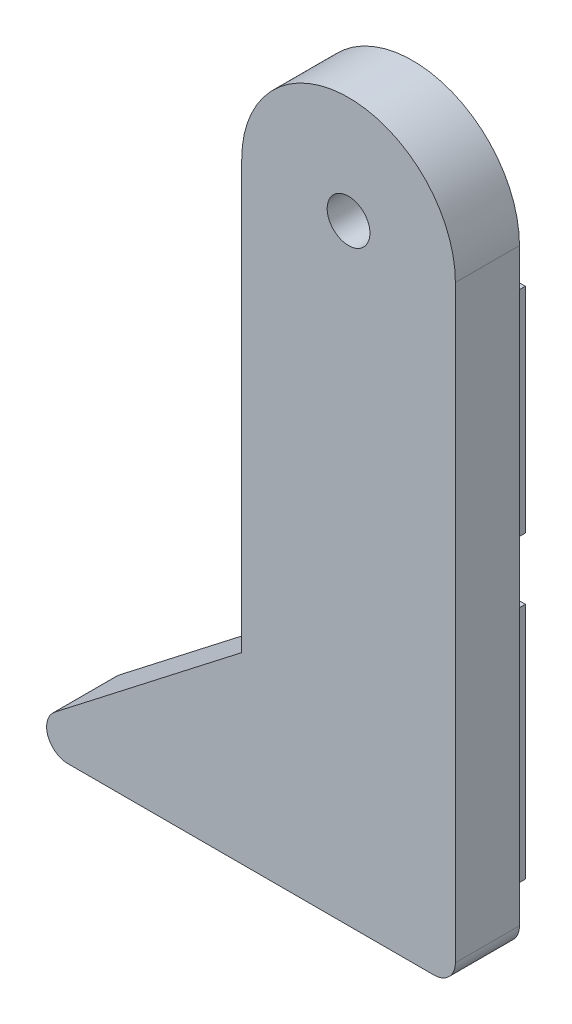
ISO-10303-21;
HEADER;
FILE_DESCRIPTION(('STEP AP214'),'2;1');
FILE_NAME('part.step','',(''),(''),'','','');
FILE_SCHEMA(('AUTOMOTIVE_DESIGN { 1 0 10303 214 1 1 1 1 }'));
ENDSEC;
DATA;
#1=APPLICATION_CONTEXT('core data for automotive mechanical design processes');
#2=APPLICATION_PROTOCOL_DEFINITION('international standard','automotive_design',2000,#1);
#3=PRODUCT_CONTEXT('',#1,'mechanical');
#4=PRODUCT('Part','Part','',(#3));
#5=PRODUCT_RELATED_PRODUCT_CATEGORY('part','',(#4));
#6=PRODUCT_DEFINITION_FORMATION('','',#4);
#7=PRODUCT_DEFINITION_CONTEXT('part definition',#1,'design');
#8=PRODUCT_DEFINITION('design','',#6,#7);
#9=PRODUCT_DEFINITION_SHAPE('','',#8);
#10=(LENGTH_UNIT() NAMED_UNIT(*) SI_UNIT(.MILLI.,.METRE.));
#11=(NAMED_UNIT(*) PLANE_ANGLE_UNIT() SI_UNIT($,.RADIAN.));
#12=(NAMED_UNIT(*) SI_UNIT($,.STERADIAN.) SOLID_ANGLE_UNIT());
#13=UNCERTAINTY_MEASURE_WITH_UNIT(LENGTH_MEASURE(1.E-05),#10,'distance_accuracy_value','');
#14=(GEOMETRIC_REPRESENTATION_CONTEXT(3) GLOBAL_UNCERTAINTY_ASSIGNED_CONTEXT((#13)) GLOBAL_UNIT_ASSIGNED_CONTEXT((#10,
#11,#12)) REPRESENTATION_CONTEXT('',''));
#15=CARTESIAN_POINT('',(0.,0.,0.));
#16=DIRECTION('',(0.,0.,1.));
#17=DIRECTION('',(1.,0.,0.));
#18=AXIS2_PLACEMENT_3D('',#15,#16,#17);
#19=CARTESIAN_POINT('',(0.,0.,0.));
#20=DIRECTION('',(0.,0.,1.));
#21=DIRECTION('',(1.,0.,0.));
#22=AXIS2_PLACEMENT_3D('',#19,#20,#21);
#23=PLANE('',#22);
#24=DIRECTION('',(1.,0.,0.));
#25=VECTOR('',#24,1.);
#26=CARTESIAN_POINT('',(2.99595345271442,-2.51040248948641,0.));
#27=LINE('',#26,#25);
#28=CARTESIAN_POINT('',(2.99595345271442,-2.51040248948641,0.));
#29=VERTEX_POINT('',#28);
#30=CARTESIAN_POINT('',(4.27531212116673,-2.51040248948641,0.));
#31=VERTEX_POINT('',#30);
#32=EDGE_CURVE('E232',#29,#31,#27,.T.);
#33=ORIENTED_EDGE('',*,*,#32,.F.);
#34=DIRECTION('',(0.,1.,0.));
#35=VECTOR('',#34,1.);
#36=CARTESIAN_POINT('',(2.99595345271442,-4.95569520370185,0.));
#37=LINE('',#36,#35);
#38=CARTESIAN_POINT('',(2.99595345271442,-4.95569520370185,0.));
#39=VERTEX_POINT('',#38);
#40=EDGE_CURVE('E299',#39,#29,#37,.T.);
#41=ORIENTED_EDGE('',*,*,#40,.F.);
#42=DIRECTION('',(0.864387868708014,-0.502825628255379,0.));
#43=VECTOR('',#42,1.);
#44=CARTESIAN_POINT('',(-1.20765360077173,-2.51040248948641,0.));
#45=LINE('',#44,#43);
#46=CARTESIAN_POINT('',(-1.20765360077173,-2.51040248948641,0.));
#47=VERTEX_POINT('',#46);
#48=EDGE_CURVE('E346',#47,#39,#45,.T.);
#49=ORIENTED_EDGE('',*,*,#48,.F.);
#50=DIRECTION('',(1.,0.,0.));
#51=VECTOR('',#50,1.);
#52=CARTESIAN_POINT('',(-4.31466750987019,-2.51040248948641,0.));
#53=LINE('',#52,#51);
#54=CARTESIAN_POINT('',(-4.31466750987019,-2.51040248948641,0.));
#55=VERTEX_POINT('',#54);
#56=EDGE_CURVE('E343',#55,#47,#53,.T.);
#57=ORIENTED_EDGE('',*,*,#56,.F.);
#58=DIRECTION('',(-0.864387868708014,0.502825628255379,0.));
#59=VECTOR('',#58,1.);
#60=CARTESIAN_POINT('',(2.99595345271442,-6.76308547073065,0.));
#61=LINE('',#60,#59);
#62=CARTESIAN_POINT('',(2.99595345271442,-6.76308547073066,0.));
#63=VERTEX_POINT('',#62);
#64=EDGE_CURVE('E340',#63,#55,#61,.T.);
#65=ORIENTED_EDGE('',*,*,#64,.F.);
#66=DIRECTION('',(0.785813113906077,0.618464024833486,0.));
#67=VECTOR('',#66,1.);
#68=CARTESIAN_POINT('',(-4.31466750987019,-12.5168149320241,0.));
#69=LINE('',#68,#67);
#70=CARTESIAN_POINT('',(-4.31466750987019,-12.5168149320241,0.));
#71=VERTEX_POINT('',#70);
#72=EDGE_CURVE('E337',#71,#63,#69,.T.);
#73=ORIENTED_EDGE('',*,*,#72,.F.);
#74=DIRECTION('',(-1.,0.,0.));
#75=VECTOR('',#74,1.);
#76=CARTESIAN_POINT('',(-1.93871569703019,-12.5168149320241,0.));
#77=LINE('',#76,#75);
#78=CARTESIAN_POINT('',(-1.93871569703019,-12.5168149320241,0.));
#79=VERTEX_POINT('',#78);
#80=EDGE_CURVE('E334',#79,#71,#77,.T.);
#81=ORIENTED_EDGE('',*,*,#80,.F.);
#82=DIRECTION('',(-0.785813113906077,-0.618464024833486,0.));
#83=VECTOR('',#82,1.);
#84=CARTESIAN_POINT('',(2.99595345271442,-8.63304754565102,0.));
#85=LINE('',#84,#83);
#86=CARTESIAN_POINT('',(2.99595345271442,-8.63304754565102,0.));
#87=VERTEX_POINT('',#86);
#88=EDGE_CURVE('E331',#87,#79,#85,.T.);
#89=ORIENTED_EDGE('',*,*,#88,.F.);
#90=DIRECTION('',(0.,1.,0.));
#91=VECTOR('',#90,1.);
#92=CARTESIAN_POINT('',(2.99595345271442,-12.5168149320241,0.));
#93=LINE('',#92,#91);
#94=CARTESIAN_POINT('',(2.99595345271442,-12.5168149320241,0.));
#95=VERTEX_POINT('',#94);
#96=EDGE_CURVE('E328',#95,#87,#93,.T.);
#97=ORIENTED_EDGE('',*,*,#96,.F.);
#98=DIRECTION('',(-1.,0.,0.));
#99=VECTOR('',#98,1.);
#100=CARTESIAN_POINT('',(4.27531212116673,-12.5168149320241,0.));
#101=LINE('',#100,#99);
#102=CARTESIAN_POINT('',(4.27531212116673,-12.5168149320241,0.));
#103=VERTEX_POINT('',#102);
#104=EDGE_CURVE('E325',#103,#95,#101,.T.);
#105=ORIENTED_EDGE('',*,*,#104,.F.);
#106=DIRECTION('',(0.,-1.,0.));
#107=VECTOR('',#106,1.);
#108=CARTESIAN_POINT('',(4.27531212116673,-2.51040248948641,0.));
#109=LINE('',#108,#107);
#110=EDGE_CURVE('E322',#31,#103,#109,.T.);
#111=ORIENTED_EDGE('',*,*,#110,.F.);
#112=EDGE_LOOP('',(#33,#41,#49,#57,#65,#73,#81,#89,#97,#105,#111));
#113=FACE_BOUND('',#112,.T.);
#114=DIRECTION('',(0.,1.,0.));
#115=VECTOR('',#114,1.);
#116=CARTESIAN_POINT('',(5.,-20.,0.));
#117=LINE('',#116,#115);
#118=CARTESIAN_POINT('',(5.,-27.5715056715313,0.));
#119=VERTEX_POINT('',#118);
#120=CARTESIAN_POINT('',(5.,0.,0.));
#121=VERTEX_POINT('',#120);
#122=EDGE_CURVE('E404',#119,#121,#117,.T.);
#123=ORIENTED_EDGE('',*,*,#122,.F.);
#124=CARTESIAN_POINT('',(4.,-27.5715056715313,0.));
#125=DIRECTION('',(0.,0.,1.));
#126=DIRECTION('',(1.,0.,0.));
#127=AXIS2_PLACEMENT_3D('',#124,#125,#126);
#128=CIRCLE('',#127,1.);
#129=CARTESIAN_POINT('',(4.,-28.5715056715313,0.));
#130=VERTEX_POINT('',#129);
#131=EDGE_CURVE('E11',#119,#130,#128,.F.);
#132=ORIENTED_EDGE('',*,*,#131,.T.);
#133=DIRECTION('',(-1.,0.,0.));
#134=VECTOR('',#133,1.);
#135=CARTESIAN_POINT('',(0.,-28.5715056715313,0.));
#136=LINE('',#135,#134);
#137=CARTESIAN_POINT('',(-13.1319402109181,-28.5715056715313,0.));
#138=VERTEX_POINT('',#137);
#139=EDGE_CURVE('E386',#130,#138,#136,.T.);
#140=ORIENTED_EDGE('',*,*,#139,.T.);
#141=CARTESIAN_POINT('',(-13.1319402109181,-27.5715056715313,0.));
#142=DIRECTION('',(0.,0.,1.));
#143=DIRECTION('',(1.,0.,0.));
#144=AXIS2_PLACEMENT_3D('',#141,#142,#143);
#145=CIRCLE('',#144,1.);
#146=CARTESIAN_POINT('',(-13.7447429846144,-26.78126978235,0.));
#147=VERTEX_POINT('',#146);
#148=EDGE_CURVE('E431',#138,#147,#145,.F.);
#149=ORIENTED_EDGE('',*,*,#148,.T.);
#150=DIRECTION('',(0.790235889181246,0.612802773696338,0.));
#151=VECTOR('',#150,1.);
#152=CARTESIAN_POINT('',(7.80753869804357,-10.0681614871782,0.));
#153=LINE('',#152,#151);
#154=CARTESIAN_POINT('',(-5.,-20.,0.));
#155=VERTEX_POINT('',#154);
#156=EDGE_CURVE('E384',#147,#155,#153,.T.);
#157=ORIENTED_EDGE('',*,*,#156,.T.);
#158=DIRECTION('',(0.,-1.,0.));
#159=VECTOR('',#158,1.);
#160=CARTESIAN_POINT('',(-5.,0.,0.));
#161=LINE('',#160,#159);
#162=CARTESIAN_POINT('',(-5.,0.,0.));
#163=VERTEX_POINT('',#162);
#164=EDGE_CURVE('E411',#163,#155,#161,.T.);
#165=ORIENTED_EDGE('',*,*,#164,.F.);
#166=CARTESIAN_POINT('',(0.,0.,0.));
#167=DIRECTION('',(0.,0.,1.));
#168=DIRECTION('',(1.,0.,0.));
#169=AXIS2_PLACEMENT_3D('',#166,#167,#168);
#170=CIRCLE('',#169,5.);
#171=EDGE_CURVE('E397',#121,#163,#170,.T.);
#172=ORIENTED_EDGE('',*,*,#171,.F.);
#173=EDGE_LOOP('',(#123,#132,#140,#149,#157,#165,#172));
#174=FACE_BOUND('',#173,.T.);
#175=CARTESIAN_POINT('',(0.,0.,0.));
#176=DIRECTION('',(0.,0.,1.));
#177=DIRECTION('',(1.,0.,0.));
#178=AXIS2_PLACEMENT_3D('',#175,#176,#177);
#179=CIRCLE('',#178,1.);
#180=CARTESIAN_POINT('',(1.,0.,0.));
#181=VERTEX_POINT('',#180);
#182=EDGE_CURVE('E393',#181,#181,#179,.T.);
#183=ORIENTED_EDGE('',*,*,#182,.T.);
#184=EDGE_LOOP('',(#183));
#185=FACE_BOUND('',#184,.T.);
#186=DIRECTION('',(1.,0.,0.));
#187=VECTOR('',#186,1.);
#188=CARTESIAN_POINT('',(2.99595345271442,-15.4018992761871,0.));
#189=LINE('',#188,#187);
#190=CARTESIAN_POINT('',(2.99595345271442,-15.4018992761871,0.));
#191=VERTEX_POINT('',#190);
#192=CARTESIAN_POINT('',(4.27531212116673,-15.4018992761871,0.));
#193=VERTEX_POINT('',#192);
#194=EDGE_CURVE('E225',#191,#193,#189,.T.);
#195=ORIENTED_EDGE('',*,*,#194,.F.);
#196=DIRECTION('',(0.,1.,0.));
#197=VECTOR('',#196,1.);
#198=CARTESIAN_POINT('',(2.99595345271442,-18.4613300843939,0.));
#199=LINE('',#198,#197);
#200=CARTESIAN_POINT('',(2.99595345271442,-18.4613300843939,0.));
#201=VERTEX_POINT('',#200);
#202=EDGE_CURVE('E227',#201,#191,#199,.T.);
#203=ORIENTED_EDGE('',*,*,#202,.F.);
#204=DIRECTION('',(0.80852907484341,-0.588456230430828,0.));
#205=VECTOR('',#204,1.);
#206=CARTESIAN_POINT('',(-1.20765360077173,-15.4018992761871,0.));
#207=LINE('',#206,#205);
#208=CARTESIAN_POINT('',(-1.20765360077173,-15.4018992761871,0.));
#209=VERTEX_POINT('',#208);
#210=EDGE_CURVE('E243',#209,#201,#207,.T.);
#211=ORIENTED_EDGE('',*,*,#210,.F.);
#212=DIRECTION('',(1.,0.,0.));
#213=VECTOR('',#212,1.);
#214=CARTESIAN_POINT('',(-4.31466750987019,-15.4018992761871,0.));
#215=LINE('',#214,#213);
#216=CARTESIAN_POINT('',(-4.31466750987019,-15.4018992761871,0.));
#217=VERTEX_POINT('',#216);
#218=EDGE_CURVE('E257',#217,#209,#215,.T.);
#219=ORIENTED_EDGE('',*,*,#218,.F.);
#220=DIRECTION('',(-0.80852907484341,0.588456230430827,0.));
#221=VECTOR('',#220,1.);
#222=CARTESIAN_POINT('',(2.99595345271442,-20.7226485078511,0.));
#223=LINE('',#222,#221);
#224=CARTESIAN_POINT('',(2.99595345271442,-20.7226485078511,0.));
#225=VERTEX_POINT('',#224);
#226=EDGE_CURVE('E260',#225,#217,#223,.T.);
#227=ORIENTED_EDGE('',*,*,#226,.F.);
#228=DIRECTION('',(0.782280144548001,0.622926781769703,0.));
#229=VECTOR('',#228,1.);
#230=CARTESIAN_POINT('',(-4.31466750987019,-26.5440689039833,0.));
#231=LINE('',#230,#229);
#232=CARTESIAN_POINT('',(-4.31466750987019,-26.5440689039833,0.));
#233=VERTEX_POINT('',#232);
#234=EDGE_CURVE('E263',#233,#225,#231,.T.);
#235=ORIENTED_EDGE('',*,*,#234,.F.);
#236=DIRECTION('',(-1.,0.,0.));
#237=VECTOR('',#236,1.);
#238=CARTESIAN_POINT('',(-1.93871569703019,-26.5440689039833,0.));
#239=LINE('',#238,#237);
#240=CARTESIAN_POINT('',(-1.93871569703019,-26.5440689039833,0.));
#241=VERTEX_POINT('',#240);
#242=EDGE_CURVE('E266',#241,#233,#239,.T.);
#243=ORIENTED_EDGE('',*,*,#242,.F.);
#244=DIRECTION('',(-0.782280144548001,-0.622926781769703,0.));
#245=VECTOR('',#244,1.);
#246=CARTESIAN_POINT('',(2.99595345271442,-22.6146101365941,0.));
#247=LINE('',#246,#245);
#248=CARTESIAN_POINT('',(2.99595345271442,-22.6146101365941,0.));
#249=VERTEX_POINT('',#248);
#250=EDGE_CURVE('E269',#249,#241,#247,.T.);
#251=ORIENTED_EDGE('',*,*,#250,.F.);
#252=DIRECTION('',(0.,1.,0.));
#253=VECTOR('',#252,1.);
#254=CARTESIAN_POINT('',(2.99595345271442,-26.5440689039833,0.));
#255=LINE('',#254,#253);
#256=CARTESIAN_POINT('',(2.99595345271442,-26.5440689039833,0.));
#257=VERTEX_POINT('',#256);
#258=EDGE_CURVE('E272',#257,#249,#255,.T.);
#259=ORIENTED_EDGE('',*,*,#258,.F.);
#260=DIRECTION('',(-1.,0.,0.));
#261=VECTOR('',#260,1.);
#262=CARTESIAN_POINT('',(4.27531212116673,-26.5440689039833,0.));
#263=LINE('',#262,#261);
#264=CARTESIAN_POINT('',(4.27531212116673,-26.5440689039833,0.));
#265=VERTEX_POINT('',#264);
#266=EDGE_CURVE('E59',#265,#257,#263,.T.);
#267=ORIENTED_EDGE('',*,*,#266,.F.);
#268=DIRECTION('',(0.,-1.,0.));
#269=VECTOR('',#268,1.);
#270=CARTESIAN_POINT('',(4.27531212116673,-15.4018992761871,0.));
#271=LINE('',#270,#269);
#272=EDGE_CURVE('E54',#193,#265,#271,.T.);
#273=ORIENTED_EDGE('',*,*,#272,.F.);
#274=EDGE_LOOP('',(#195,#203,#211,#219,#227,#235,#243,#251,#259,#267,#273));
#275=FACE_BOUND('',#274,.T.);
#276=ADVANCED_FACE('F39',(#113,#174,#185,#275),#23,.F.);
#277=CARTESIAN_POINT('',(0.,0.,3.));
#278=DIRECTION('',(0.,0.,1.));
#279=DIRECTION('',(1.,0.,0.));
#280=AXIS2_PLACEMENT_3D('',#277,#278,#279);
#281=PLANE('',#280);
#282=DIRECTION('',(1.,0.,0.));
#283=VECTOR('',#282,1.);
#284=CARTESIAN_POINT('',(0.,-28.5715056715313,3.));
#285=LINE('',#284,#283);
#286=CARTESIAN_POINT('',(-13.1319402109181,-28.5715056715313,3.));
#287=VERTEX_POINT('',#286);
#288=CARTESIAN_POINT('',(4.,-28.5715056715313,3.));
#289=VERTEX_POINT('',#288);
#290=EDGE_CURVE('E387',#287,#289,#285,.T.);
#291=ORIENTED_EDGE('',*,*,#290,.T.);
#292=CARTESIAN_POINT('',(4.,-27.5715056715313,3.));
#293=DIRECTION('',(0.,0.,1.));
#294=DIRECTION('',(1.,0.,0.));
#295=AXIS2_PLACEMENT_3D('',#292,#293,#294);
#296=CIRCLE('',#295,1.);
#297=CARTESIAN_POINT('',(5.,-27.5715056715313,3.));
#298=VERTEX_POINT('',#297);
#299=EDGE_CURVE('E436',#289,#298,#296,.T.);
#300=ORIENTED_EDGE('',*,*,#299,.T.);
#301=DIRECTION('',(0.,1.,0.));
#302=VECTOR('',#301,1.);
#303=CARTESIAN_POINT('',(5.,-20.,3.));
#304=LINE('',#303,#302);
#305=CARTESIAN_POINT('',(5.,0.,3.));
#306=VERTEX_POINT('',#305);
#307=EDGE_CURVE('E406',#298,#306,#304,.T.);
#308=ORIENTED_EDGE('',*,*,#307,.T.);
#309=CARTESIAN_POINT('',(0.,0.,3.));
#310=DIRECTION('',(0.,0.,1.));
#311=DIRECTION('',(1.,0.,0.));
#312=AXIS2_PLACEMENT_3D('',#309,#310,#311);
#313=CIRCLE('',#312,5.);
#314=CARTESIAN_POINT('',(-5.,0.,3.));
#315=VERTEX_POINT('',#314);
#316=EDGE_CURVE('E400',#306,#315,#313,.T.);
#317=ORIENTED_EDGE('',*,*,#316,.T.);
#318=DIRECTION('',(0.,-1.,0.));
#319=VECTOR('',#318,1.);
#320=CARTESIAN_POINT('',(-5.,0.,3.));
#321=LINE('',#320,#319);
#322=CARTESIAN_POINT('',(-5.,-20.,3.));
#323=VERTEX_POINT('',#322);
#324=EDGE_CURVE('E403',#315,#323,#321,.T.);
#325=ORIENTED_EDGE('',*,*,#324,.T.);
#326=DIRECTION('',(-0.790235889181246,-0.612802773696338,0.));
#327=VECTOR('',#326,1.);
#328=CARTESIAN_POINT('',(7.80753869804357,-10.0681614871782,3.));
#329=LINE('',#328,#327);
#330=CARTESIAN_POINT('',(-13.7447429846144,-26.78126978235,3.));
#331=VERTEX_POINT('',#330);
#332=EDGE_CURVE('E383',#323,#331,#329,.T.);
#333=ORIENTED_EDGE('',*,*,#332,.T.);
#334=CARTESIAN_POINT('',(-13.1319402109181,-27.5715056715313,3.));
#335=DIRECTION('',(0.,0.,1.));
#336=DIRECTION('',(1.,0.,0.));
#337=AXIS2_PLACEMENT_3D('',#334,#335,#336);
#338=CIRCLE('',#337,1.);
#339=EDGE_CURVE('E426',#331,#287,#338,.T.);
#340=ORIENTED_EDGE('',*,*,#339,.T.);
#341=EDGE_LOOP('',(#291,#300,#308,#317,#325,#333,#340));
#342=FACE_BOUND('',#341,.T.);
#343=CARTESIAN_POINT('',(0.,0.,3.));
#344=DIRECTION('',(0.,0.,1.));
#345=DIRECTION('',(1.,0.,0.));
#346=AXIS2_PLACEMENT_3D('',#343,#344,#345);
#347=CIRCLE('',#346,1.);
#348=CARTESIAN_POINT('',(1.,0.,3.));
#349=VERTEX_POINT('',#348);
#350=EDGE_CURVE('E394',#349,#349,#347,.T.);
#351=ORIENTED_EDGE('',*,*,#350,.F.);
#352=EDGE_LOOP('',(#351));
#353=FACE_BOUND('',#352,.T.);
#354=ADVANCED_FACE('F455',(#342,#353),#281,.T.);
#355=CARTESIAN_POINT('',(0.,0.,3.));
#356=DIRECTION('',(0.,0.,-1.));
#357=DIRECTION('',(-1.,0.,0.));
#358=AXIS2_PLACEMENT_3D('',#355,#356,#357);
#359=CYLINDRICAL_SURFACE('',#358,5.);
#360=ORIENTED_EDGE('',*,*,#171,.T.);
#361=DIRECTION('',(0.,0.,-1.));
#362=VECTOR('',#361,1.);
#363=CARTESIAN_POINT('',(-5.,0.,3.));
#364=LINE('',#363,#362);
#365=EDGE_CURVE('E420',#315,#163,#364,.T.);
#366=ORIENTED_EDGE('',*,*,#365,.F.);
#367=ORIENTED_EDGE('',*,*,#316,.F.);
#368=DIRECTION('',(0.,0.,-1.));
#369=VECTOR('',#368,1.);
#370=CARTESIAN_POINT('',(5.,0.,3.));
#371=LINE('',#370,#369);
#372=EDGE_CURVE('E408',#306,#121,#371,.T.);
#373=ORIENTED_EDGE('',*,*,#372,.T.);
#374=EDGE_LOOP('',(#360,#366,#367,#373));
#375=FACE_BOUND('',#374,.T.);
#376=ADVANCED_FACE('F471',(#375),#359,.T.);
#377=CARTESIAN_POINT('',(-5.,0.,3.));
#378=DIRECTION('',(1.,0.,0.));
#379=DIRECTION('',(0.,1.,0.));
#380=AXIS2_PLACEMENT_3D('',#377,#378,#379);
#381=PLANE('',#380);
#382=ORIENTED_EDGE('',*,*,#164,.T.);
#383=DIRECTION('',(0.,0.,-1.));
#384=VECTOR('',#383,1.);
#385=CARTESIAN_POINT('',(-5.,-20.,3.));
#386=LINE('',#385,#384);
#387=EDGE_CURVE('E417',#323,#155,#386,.T.);
#388=ORIENTED_EDGE('',*,*,#387,.F.);
#389=ORIENTED_EDGE('',*,*,#324,.F.);
#390=ORIENTED_EDGE('',*,*,#365,.T.);
#391=EDGE_LOOP('',(#382,#388,#389,#390));
#392=FACE_BOUND('',#391,.T.);
#393=ADVANCED_FACE('F467',(#392),#381,.F.);
#394=CARTESIAN_POINT('',(5.,-20.,3.));
#395=DIRECTION('',(-1.,0.,0.));
#396=DIRECTION('',(0.,-1.,0.));
#397=AXIS2_PLACEMENT_3D('',#394,#395,#396);
#398=PLANE('',#397);
#399=ORIENTED_EDGE('',*,*,#307,.F.);
#400=DIRECTION('',(0.,0.,1.));
#401=VECTOR('',#400,1.);
#402=CARTESIAN_POINT('',(5.,-27.5715056715313,0.));
#403=LINE('',#402,#401);
#404=EDGE_CURVE('E47',#298,#119,#403,.F.);
#405=ORIENTED_EDGE('',*,*,#404,.T.);
#406=ORIENTED_EDGE('',*,*,#122,.T.);
#407=ORIENTED_EDGE('',*,*,#372,.F.);
#408=EDGE_LOOP('',(#399,#405,#406,#407));
#409=FACE_BOUND('',#408,.T.);
#410=ADVANCED_FACE('F441',(#409),#398,.F.);
#411=CARTESIAN_POINT('',(0.,0.,3.));
#412=DIRECTION('',(0.,0.,-1.));
#413=DIRECTION('',(-1.,0.,0.));
#414=AXIS2_PLACEMENT_3D('',#411,#412,#413);
#415=CYLINDRICAL_SURFACE('',#414,1.);
#416=ORIENTED_EDGE('',*,*,#350,.T.);
#417=EDGE_LOOP('',(#416));
#418=FACE_BOUND('',#417,.T.);
#419=ORIENTED_EDGE('',*,*,#182,.F.);
#420=EDGE_LOOP('',(#419));
#421=FACE_BOUND('',#420,.T.);
#422=ADVANCED_FACE('F488',(#418,#421),#415,.F.);
#423=CARTESIAN_POINT('',(7.80753869804357,-10.0681614871782,-22.73133128622));
#424=DIRECTION('',(-0.612802773696338,0.790235889181246,0.));
#425=DIRECTION('',(-0.790235889181246,-0.612802773696338,0.));
#426=AXIS2_PLACEMENT_3D('',#423,#424,#425);
#427=PLANE('',#426);
#428=ORIENTED_EDGE('',*,*,#156,.F.);
#429=DIRECTION('',(0.,0.,1.));
#430=VECTOR('',#429,1.);
#431=CARTESIAN_POINT('',(-13.7447429846144,-26.78126978235,-22.73133128622));
#432=LINE('',#431,#430);
#433=EDGE_CURVE('E423',#147,#331,#432,.T.);
#434=ORIENTED_EDGE('',*,*,#433,.T.);
#435=ORIENTED_EDGE('',*,*,#332,.F.);
#436=ORIENTED_EDGE('',*,*,#387,.T.);
#437=EDGE_LOOP('',(#428,#434,#435,#436));
#438=FACE_BOUND('',#437,.T.);
#439=ADVANCED_FACE('F464',(#438),#427,.T.);
#440=CARTESIAN_POINT('',(0.,-28.5715056715313,-22.73133128622));
#441=DIRECTION('',(0.,-1.,0.));
#442=DIRECTION('',(0.,0.,-1.));
#443=AXIS2_PLACEMENT_3D('',#440,#441,#442);
#444=PLANE('',#443);
#445=ORIENTED_EDGE('',*,*,#139,.F.);
#446=DIRECTION('',(0.,0.,1.));
#447=VECTOR('',#446,1.);
#448=CARTESIAN_POINT('',(4.,-28.5715056715313,3.));
#449=LINE('',#448,#447);
#450=EDGE_CURVE('E433',#130,#289,#449,.T.);
#451=ORIENTED_EDGE('',*,*,#450,.T.);
#452=ORIENTED_EDGE('',*,*,#290,.F.);
#453=DIRECTION('',(0.,0.,1.));
#454=VECTOR('',#453,1.);
#455=CARTESIAN_POINT('',(-13.1319402109181,-28.5715056715313,-22.73133128622));
#456=LINE('',#455,#454);
#457=EDGE_CURVE('E428',#287,#138,#456,.F.);
#458=ORIENTED_EDGE('',*,*,#457,.T.);
#459=EDGE_LOOP('',(#445,#451,#452,#458));
#460=FACE_BOUND('',#459,.T.);
#461=ADVANCED_FACE('F452',(#460),#444,.T.);
#462=CARTESIAN_POINT('',(-13.1319402109181,-27.5715056715313,-22.73133128622));
#463=DIRECTION('',(0.,0.,1.));
#464=DIRECTION('',(1.,0.,0.));
#465=AXIS2_PLACEMENT_3D('',#462,#463,#464);
#466=CYLINDRICAL_SURFACE('',#465,1.);
#467=ORIENTED_EDGE('',*,*,#148,.F.);
#468=ORIENTED_EDGE('',*,*,#457,.F.);
#469=ORIENTED_EDGE('',*,*,#339,.F.);
#470=ORIENTED_EDGE('',*,*,#433,.F.);
#471=EDGE_LOOP('',(#467,#468,#469,#470));
#472=FACE_BOUND('',#471,.T.);
#473=ADVANCED_FACE('F461',(#472),#466,.T.);
#474=CARTESIAN_POINT('',(4.,-27.5715056715313,-22.73133128622));
#475=DIRECTION('',(0.,0.,-1.));
#476=DIRECTION('',(-1.,0.,0.));
#477=AXIS2_PLACEMENT_3D('',#474,#475,#476);
#478=CYLINDRICAL_SURFACE('',#477,1.);
#479=ORIENTED_EDGE('',*,*,#131,.F.);
#480=ORIENTED_EDGE('',*,*,#404,.F.);
#481=ORIENTED_EDGE('',*,*,#299,.F.);
#482=ORIENTED_EDGE('',*,*,#450,.F.);
#483=EDGE_LOOP('',(#479,#480,#481,#482));
#484=FACE_BOUND('',#483,.T.);
#485=ADVANCED_FACE('F41',(#484),#478,.T.);
#486=CARTESIAN_POINT('',(2.99595345271442,-2.51040248948641,-1.));
#487=DIRECTION('',(0.,-1.,0.));
#488=DIRECTION('',(0.,0.,-1.));
#489=AXIS2_PLACEMENT_3D('',#486,#487,#488);
#490=PLANE('',#489);
#491=ORIENTED_EDGE('',*,*,#32,.T.);
#492=DIRECTION('',(0.,0.,1.));
#493=VECTOR('',#492,1.);
#494=CARTESIAN_POINT('',(4.27531212116673,-2.51040248948641,-1.));
#495=LINE('',#494,#493);
#496=CARTESIAN_POINT('',(4.27531212116673,-2.51040248948641,-1.));
#497=VERTEX_POINT('',#496);
#498=EDGE_CURVE('E380',#497,#31,#495,.T.);
#499=ORIENTED_EDGE('',*,*,#498,.F.);
#500=DIRECTION('',(1.,0.,0.));
#501=VECTOR('',#500,1.);
#502=CARTESIAN_POINT('',(2.99595345271442,-2.51040248948641,-1.));
#503=LINE('',#502,#501);
#504=CARTESIAN_POINT('',(2.99595345271442,-2.51040248948641,-1.));
#505=VERTEX_POINT('',#504);
#506=EDGE_CURVE('E295',#505,#497,#503,.T.);
#507=ORIENTED_EDGE('',*,*,#506,.F.);
#508=DIRECTION('',(0.,0.,1.));
#509=VECTOR('',#508,1.);
#510=CARTESIAN_POINT('',(2.99595345271442,-2.51040248948641,-1.));
#511=LINE('',#510,#509);
#512=EDGE_CURVE('E319',#505,#29,#511,.T.);
#513=ORIENTED_EDGE('',*,*,#512,.T.);
#514=EDGE_LOOP('',(#491,#499,#507,#513));
#515=FACE_BOUND('',#514,.T.);
#516=ADVANCED_FACE('F501',(#515),#490,.F.);
#517=CARTESIAN_POINT('',(4.27531212116673,-2.51040248948641,-1.));
#518=DIRECTION('',(-1.,0.,0.));
#519=DIRECTION('',(0.,0.,1.));
#520=AXIS2_PLACEMENT_3D('',#517,#518,#519);
#521=PLANE('',#520);
#522=ORIENTED_EDGE('',*,*,#110,.T.);
#523=DIRECTION('',(0.,0.,1.));
#524=VECTOR('',#523,1.);
#525=CARTESIAN_POINT('',(4.27531212116673,-12.5168149320241,-1.));
#526=LINE('',#525,#524);
#527=CARTESIAN_POINT('',(4.27531212116673,-12.5168149320241,-1.));
#528=VERTEX_POINT('',#527);
#529=EDGE_CURVE('E377',#528,#103,#526,.T.);
#530=ORIENTED_EDGE('',*,*,#529,.F.);
#531=DIRECTION('',(0.,-1.,0.));
#532=VECTOR('',#531,1.);
#533=CARTESIAN_POINT('',(4.27531212116673,-2.51040248948641,-1.));
#534=LINE('',#533,#532);
#535=EDGE_CURVE('E298',#497,#528,#534,.T.);
#536=ORIENTED_EDGE('',*,*,#535,.F.);
#537=ORIENTED_EDGE('',*,*,#498,.T.);
#538=EDGE_LOOP('',(#522,#530,#536,#537));
#539=FACE_BOUND('',#538,.T.);
#540=ADVANCED_FACE('F504',(#539),#521,.F.);
#541=CARTESIAN_POINT('',(4.27531212116673,-12.5168149320241,-1.));
#542=DIRECTION('',(0.,1.,0.));
#543=DIRECTION('',(0.,0.,1.));
#544=AXIS2_PLACEMENT_3D('',#541,#542,#543);
#545=PLANE('',#544);
#546=ORIENTED_EDGE('',*,*,#104,.T.);
#547=DIRECTION('',(0.,0.,1.));
#548=VECTOR('',#547,1.);
#549=CARTESIAN_POINT('',(2.99595345271442,-12.5168149320241,-1.));
#550=LINE('',#549,#548);
#551=CARTESIAN_POINT('',(2.99595345271442,-12.5168149320241,-1.));
#552=VERTEX_POINT('',#551);
#553=EDGE_CURVE('E374',#552,#95,#550,.T.);
#554=ORIENTED_EDGE('',*,*,#553,.F.);
#555=DIRECTION('',(-1.,0.,0.));
#556=VECTOR('',#555,1.);
#557=CARTESIAN_POINT('',(4.27531212116673,-12.5168149320241,-1.));
#558=LINE('',#557,#556);
#559=EDGE_CURVE('E301',#528,#552,#558,.T.);
#560=ORIENTED_EDGE('',*,*,#559,.F.);
#561=ORIENTED_EDGE('',*,*,#529,.T.);
#562=EDGE_LOOP('',(#546,#554,#560,#561));
#563=FACE_BOUND('',#562,.T.);
#564=ADVANCED_FACE('F508',(#563),#545,.F.);
#565=CARTESIAN_POINT('',(2.99595345271442,-12.5168149320241,-1.));
#566=DIRECTION('',(1.,0.,0.));
#567=DIRECTION('',(0.,0.,-1.));
#568=AXIS2_PLACEMENT_3D('',#565,#566,#567);
#569=PLANE('',#568);
#570=ORIENTED_EDGE('',*,*,#96,.T.);
#571=DIRECTION('',(0.,0.,1.));
#572=VECTOR('',#571,1.);
#573=CARTESIAN_POINT('',(2.99595345271442,-8.63304754565102,-1.));
#574=LINE('',#573,#572);
#575=CARTESIAN_POINT('',(2.99595345271442,-8.63304754565102,-1.));
#576=VERTEX_POINT('',#575);
#577=EDGE_CURVE('E371',#576,#87,#574,.T.);
#578=ORIENTED_EDGE('',*,*,#577,.F.);
#579=DIRECTION('',(0.,1.,0.));
#580=VECTOR('',#579,1.);
#581=CARTESIAN_POINT('',(2.99595345271442,-12.5168149320241,-1.));
#582=LINE('',#581,#580);
#583=EDGE_CURVE('E303',#552,#576,#582,.T.);
#584=ORIENTED_EDGE('',*,*,#583,.F.);
#585=ORIENTED_EDGE('',*,*,#553,.T.);
#586=EDGE_LOOP('',(#570,#578,#584,#585));
#587=FACE_BOUND('',#586,.T.);
#588=ADVANCED_FACE('F512',(#587),#569,.F.);
#589=CARTESIAN_POINT('',(2.99595345271442,-8.63304754565102,-1.));
#590=DIRECTION('',(-0.618464024833486,0.785813113906077,0.));
#591=DIRECTION('',(-0.785813113906077,-0.618464024833486,0.));
#592=AXIS2_PLACEMENT_3D('',#589,#590,#591);
#593=PLANE('',#592);
#594=ORIENTED_EDGE('',*,*,#88,.T.);
#595=DIRECTION('',(0.,0.,1.));
#596=VECTOR('',#595,1.);
#597=CARTESIAN_POINT('',(-1.93871569703019,-12.5168149320241,-1.));
#598=LINE('',#597,#596);
#599=CARTESIAN_POINT('',(-1.93871569703019,-12.5168149320241,-1.));
#600=VERTEX_POINT('',#599);
#601=EDGE_CURVE('E368',#600,#79,#598,.T.);
#602=ORIENTED_EDGE('',*,*,#601,.F.);
#603=DIRECTION('',(-0.785813113906077,-0.618464024833486,0.));
#604=VECTOR('',#603,1.);
#605=CARTESIAN_POINT('',(2.99595345271442,-8.63304754565102,-1.));
#606=LINE('',#605,#604);
#607=EDGE_CURVE('E305',#576,#600,#606,.T.);
#608=ORIENTED_EDGE('',*,*,#607,.F.);
#609=ORIENTED_EDGE('',*,*,#577,.T.);
#610=EDGE_LOOP('',(#594,#602,#608,#609));
#611=FACE_BOUND('',#610,.T.);
#612=ADVANCED_FACE('F516',(#611),#593,.F.);
#613=CARTESIAN_POINT('',(-1.93871569703019,-12.5168149320241,-1.));
#614=DIRECTION('',(0.,1.,0.));
#615=DIRECTION('',(0.,0.,1.));
#616=AXIS2_PLACEMENT_3D('',#613,#614,#615);
#617=PLANE('',#616);
#618=ORIENTED_EDGE('',*,*,#80,.T.);
#619=DIRECTION('',(0.,0.,1.));
#620=VECTOR('',#619,1.);
#621=CARTESIAN_POINT('',(-4.31466750987019,-12.5168149320241,-1.));
#622=LINE('',#621,#620);
#623=CARTESIAN_POINT('',(-4.31466750987019,-12.5168149320241,-1.));
#624=VERTEX_POINT('',#623);
#625=EDGE_CURVE('E365',#624,#71,#622,.T.);
#626=ORIENTED_EDGE('',*,*,#625,.F.);
#627=DIRECTION('',(-1.,0.,0.));
#628=VECTOR('',#627,1.);
#629=CARTESIAN_POINT('',(-1.93871569703019,-12.5168149320241,-1.));
#630=LINE('',#629,#628);
#631=EDGE_CURVE('E307',#600,#624,#630,.T.);
#632=ORIENTED_EDGE('',*,*,#631,.F.);
#633=ORIENTED_EDGE('',*,*,#601,.T.);
#634=EDGE_LOOP('',(#618,#626,#632,#633));
#635=FACE_BOUND('',#634,.T.);
#636=ADVANCED_FACE('F520',(#635),#617,.F.);
#637=CARTESIAN_POINT('',(-4.31466750987019,-12.5168149320241,-1.));
#638=DIRECTION('',(0.618464024833486,-0.785813113906077,0.));
#639=DIRECTION('',(0.785813113906077,0.618464024833486,0.));
#640=AXIS2_PLACEMENT_3D('',#637,#638,#639);
#641=PLANE('',#640);
#642=ORIENTED_EDGE('',*,*,#72,.T.);
#643=DIRECTION('',(0.,0.,1.));
#644=VECTOR('',#643,1.);
#645=CARTESIAN_POINT('',(2.99595345271442,-6.76308547073065,-1.));
#646=LINE('',#645,#644);
#647=CARTESIAN_POINT('',(2.99595345271442,-6.76308547073065,-1.));
#648=VERTEX_POINT('',#647);
#649=EDGE_CURVE('E362',#648,#63,#646,.T.);
#650=ORIENTED_EDGE('',*,*,#649,.F.);
#651=DIRECTION('',(0.785813113906077,0.618464024833486,0.));
#652=VECTOR('',#651,1.);
#653=CARTESIAN_POINT('',(-4.31466750987019,-12.5168149320241,-1.));
#654=LINE('',#653,#652);
#655=EDGE_CURVE('E309',#624,#648,#654,.T.);
#656=ORIENTED_EDGE('',*,*,#655,.F.);
#657=ORIENTED_EDGE('',*,*,#625,.T.);
#658=EDGE_LOOP('',(#642,#650,#656,#657));
#659=FACE_BOUND('',#658,.T.);
#660=ADVANCED_FACE('F524',(#659),#641,.F.);
#661=CARTESIAN_POINT('',(2.99595345271442,-6.76308547073065,-1.));
#662=DIRECTION('',(0.502825628255379,0.864387868708014,0.));
#663=DIRECTION('',(-0.864387868708014,0.502825628255379,0.));
#664=AXIS2_PLACEMENT_3D('',#661,#662,#663);
#665=PLANE('',#664);
#666=ORIENTED_EDGE('',*,*,#64,.T.);
#667=DIRECTION('',(0.,0.,1.));
#668=VECTOR('',#667,1.);
#669=CARTESIAN_POINT('',(-4.31466750987019,-2.51040248948641,-1.));
#670=LINE('',#669,#668);
#671=CARTESIAN_POINT('',(-4.31466750987019,-2.51040248948641,-1.));
#672=VERTEX_POINT('',#671);
#673=EDGE_CURVE('E359',#672,#55,#670,.T.);
#674=ORIENTED_EDGE('',*,*,#673,.F.);
#675=DIRECTION('',(-0.864387868708014,0.502825628255379,0.));
#676=VECTOR('',#675,1.);
#677=CARTESIAN_POINT('',(2.99595345271442,-6.76308547073065,-1.));
#678=LINE('',#677,#676);
#679=EDGE_CURVE('E311',#648,#672,#678,.T.);
#680=ORIENTED_EDGE('',*,*,#679,.F.);
#681=ORIENTED_EDGE('',*,*,#649,.T.);
#682=EDGE_LOOP('',(#666,#674,#680,#681));
#683=FACE_BOUND('',#682,.T.);
#684=ADVANCED_FACE('F528',(#683),#665,.F.);
#685=CARTESIAN_POINT('',(-4.31466750987019,-2.51040248948641,-1.));
#686=DIRECTION('',(0.,-1.,0.));
#687=DIRECTION('',(0.,0.,-1.));
#688=AXIS2_PLACEMENT_3D('',#685,#686,#687);
#689=PLANE('',#688);
#690=ORIENTED_EDGE('',*,*,#56,.T.);
#691=DIRECTION('',(0.,0.,1.));
#692=VECTOR('',#691,1.);
#693=CARTESIAN_POINT('',(-1.20765360077173,-2.51040248948641,-1.));
#694=LINE('',#693,#692);
#695=CARTESIAN_POINT('',(-1.20765360077173,-2.51040248948641,-1.));
#696=VERTEX_POINT('',#695);
#697=EDGE_CURVE('E356',#696,#47,#694,.T.);
#698=ORIENTED_EDGE('',*,*,#697,.F.);
#699=DIRECTION('',(1.,0.,0.));
#700=VECTOR('',#699,1.);
#701=CARTESIAN_POINT('',(-4.31466750987019,-2.51040248948641,-1.));
#702=LINE('',#701,#700);
#703=EDGE_CURVE('E313',#672,#696,#702,.T.);
#704=ORIENTED_EDGE('',*,*,#703,.F.);
#705=ORIENTED_EDGE('',*,*,#673,.T.);
#706=EDGE_LOOP('',(#690,#698,#704,#705));
#707=FACE_BOUND('',#706,.T.);
#708=ADVANCED_FACE('F532',(#707),#689,.F.);
#709=CARTESIAN_POINT('',(-1.20765360077173,-2.51040248948641,-1.));
#710=DIRECTION('',(-0.502825628255379,-0.864387868708014,0.));
#711=DIRECTION('',(0.864387868708014,-0.502825628255379,0.));
#712=AXIS2_PLACEMENT_3D('',#709,#710,#711);
#713=PLANE('',#712);
#714=ORIENTED_EDGE('',*,*,#48,.T.);
#715=DIRECTION('',(0.,0.,1.));
#716=VECTOR('',#715,1.);
#717=CARTESIAN_POINT('',(2.99595345271442,-4.95569520370185,-1.));
#718=LINE('',#717,#716);
#719=CARTESIAN_POINT('',(2.99595345271442,-4.95569520370185,-1.));
#720=VERTEX_POINT('',#719);
#721=EDGE_CURVE('E353',#720,#39,#718,.T.);
#722=ORIENTED_EDGE('',*,*,#721,.F.);
#723=DIRECTION('',(0.864387868708014,-0.502825628255379,0.));
#724=VECTOR('',#723,1.);
#725=CARTESIAN_POINT('',(-1.20765360077173,-2.51040248948641,-1.));
#726=LINE('',#725,#724);
#727=EDGE_CURVE('E315',#696,#720,#726,.T.);
#728=ORIENTED_EDGE('',*,*,#727,.F.);
#729=ORIENTED_EDGE('',*,*,#697,.T.);
#730=EDGE_LOOP('',(#714,#722,#728,#729));
#731=FACE_BOUND('',#730,.T.);
#732=ADVANCED_FACE('F536',(#731),#713,.F.);
#733=CARTESIAN_POINT('',(2.99595345271442,-4.95569520370185,-1.));
#734=DIRECTION('',(1.,0.,0.));
#735=DIRECTION('',(0.,0.,-1.));
#736=AXIS2_PLACEMENT_3D('',#733,#734,#735);
#737=PLANE('',#736);
#738=ORIENTED_EDGE('',*,*,#40,.T.);
#739=ORIENTED_EDGE('',*,*,#512,.F.);
#740=DIRECTION('',(0.,1.,0.));
#741=VECTOR('',#740,1.);
#742=CARTESIAN_POINT('',(2.99595345271442,-4.95569520370185,-1.));
#743=LINE('',#742,#741);
#744=EDGE_CURVE('E317',#720,#505,#743,.T.);
#745=ORIENTED_EDGE('',*,*,#744,.F.);
#746=ORIENTED_EDGE('',*,*,#721,.T.);
#747=EDGE_LOOP('',(#738,#739,#745,#746));
#748=FACE_BOUND('',#747,.T.);
#749=ADVANCED_FACE('F540',(#748),#737,.F.);
#750=CARTESIAN_POINT('',(0.,0.,-1.));
#751=DIRECTION('',(0.,0.,-1.));
#752=DIRECTION('',(-1.,0.,0.));
#753=AXIS2_PLACEMENT_3D('',#750,#751,#752);
#754=PLANE('',#753);
#755=ORIENTED_EDGE('',*,*,#506,.T.);
#756=ORIENTED_EDGE('',*,*,#535,.T.);
#757=ORIENTED_EDGE('',*,*,#559,.T.);
#758=ORIENTED_EDGE('',*,*,#583,.T.);
#759=ORIENTED_EDGE('',*,*,#607,.T.);
#760=ORIENTED_EDGE('',*,*,#631,.T.);
#761=ORIENTED_EDGE('',*,*,#655,.T.);
#762=ORIENTED_EDGE('',*,*,#679,.T.);
#763=ORIENTED_EDGE('',*,*,#703,.T.);
#764=ORIENTED_EDGE('',*,*,#727,.T.);
#765=ORIENTED_EDGE('',*,*,#744,.T.);
#766=EDGE_LOOP('',(#755,#756,#757,#758,#759,#760,#761,#762,#763,#764,#765));
#767=FACE_BOUND('',#766,.T.);
#768=ADVANCED_FACE('F544',(#767),#754,.T.);
#769=CARTESIAN_POINT('',(2.99595345271442,-15.4018992761871,-1.));
#770=DIRECTION('',(0.,-1.,0.));
#771=DIRECTION('',(0.,0.,-1.));
#772=AXIS2_PLACEMENT_3D('',#769,#770,#771);
#773=PLANE('',#772);
#774=ORIENTED_EDGE('',*,*,#194,.T.);
#775=DIRECTION('',(0.,0.,1.));
#776=VECTOR('',#775,1.);
#777=CARTESIAN_POINT('',(4.27531212116673,-15.4018992761871,-1.));
#778=LINE('',#777,#776);
#779=CARTESIAN_POINT('',(4.27531212116673,-15.4018992761871,-1.));
#780=VERTEX_POINT('',#779);
#781=EDGE_CURVE('E871',#780,#193,#778,.T.);
#782=ORIENTED_EDGE('',*,*,#781,.F.);
#783=DIRECTION('',(1.,0.,0.));
#784=VECTOR('',#783,1.);
#785=CARTESIAN_POINT('',(2.99595345271442,-15.4018992761871,-1.));
#786=LINE('',#785,#784);
#787=CARTESIAN_POINT('',(2.99595345271442,-15.4018992761871,-1.));
#788=VERTEX_POINT('',#787);
#789=EDGE_CURVE('E244',#788,#780,#786,.T.);
#790=ORIENTED_EDGE('',*,*,#789,.F.);
#791=DIRECTION('',(0.,0.,1.));
#792=VECTOR('',#791,1.);
#793=CARTESIAN_POINT('',(2.99595345271442,-15.4018992761871,-1.));
#794=LINE('',#793,#792);
#795=EDGE_CURVE('E239',#788,#191,#794,.T.);
#796=ORIENTED_EDGE('',*,*,#795,.T.);
#797=EDGE_LOOP('',(#774,#782,#790,#796));
#798=FACE_BOUND('',#797,.T.);
#799=ADVANCED_FACE('F246',(#798),#773,.F.);
#800=CARTESIAN_POINT('',(4.27531212116673,-15.4018992761871,-1.));
#801=DIRECTION('',(-1.,0.,0.));
#802=DIRECTION('',(0.,0.,1.));
#803=AXIS2_PLACEMENT_3D('',#800,#801,#802);
#804=PLANE('',#803);
#805=ORIENTED_EDGE('',*,*,#272,.T.);
#806=DIRECTION('',(0.,0.,1.));
#807=VECTOR('',#806,1.);
#808=CARTESIAN_POINT('',(4.27531212116673,-26.5440689039833,-1.));
#809=LINE('',#808,#807);
#810=CARTESIAN_POINT('',(4.27531212116673,-26.5440689039833,-1.));
#811=VERTEX_POINT('',#810);
#812=EDGE_CURVE('E869',#811,#265,#809,.T.);
#813=ORIENTED_EDGE('',*,*,#812,.F.);
#814=DIRECTION('',(0.,-1.,0.));
#815=VECTOR('',#814,1.);
#816=CARTESIAN_POINT('',(4.27531212116673,-15.4018992761871,-1.));
#817=LINE('',#816,#815);
#818=EDGE_CURVE('E292',#780,#811,#817,.T.);
#819=ORIENTED_EDGE('',*,*,#818,.F.);
#820=ORIENTED_EDGE('',*,*,#781,.T.);
#821=EDGE_LOOP('',(#805,#813,#819,#820));
#822=FACE_BOUND('',#821,.T.);
#823=ADVANCED_FACE('F586',(#822),#804,.F.);
#824=CARTESIAN_POINT('',(4.27531212116673,-26.5440689039833,-1.));
#825=DIRECTION('',(0.,1.,0.));
#826=DIRECTION('',(0.,0.,1.));
#827=AXIS2_PLACEMENT_3D('',#824,#825,#826);
#828=PLANE('',#827);
#829=ORIENTED_EDGE('',*,*,#266,.T.);
#830=DIRECTION('',(0.,0.,1.));
#831=VECTOR('',#830,1.);
#832=CARTESIAN_POINT('',(2.99595345271442,-26.5440689039833,-1.));
#833=LINE('',#832,#831);
#834=CARTESIAN_POINT('',(2.99595345271442,-26.5440689039833,-1.));
#835=VERTEX_POINT('',#834);
#836=EDGE_CURVE('E874',#835,#257,#833,.T.);
#837=ORIENTED_EDGE('',*,*,#836,.F.);
#838=DIRECTION('',(-1.,0.,0.));
#839=VECTOR('',#838,1.);
#840=CARTESIAN_POINT('',(4.27531212116673,-26.5440689039833,-1.));
#841=LINE('',#840,#839);
#842=EDGE_CURVE('E290',#811,#835,#841,.T.);
#843=ORIENTED_EDGE('',*,*,#842,.F.);
#844=ORIENTED_EDGE('',*,*,#812,.T.);
#845=EDGE_LOOP('',(#829,#837,#843,#844));
#846=FACE_BOUND('',#845,.T.);
#847=ADVANCED_FACE('F582',(#846),#828,.F.);
#848=CARTESIAN_POINT('',(2.99595345271442,-26.5440689039833,-1.));
#849=DIRECTION('',(1.,0.,0.));
#850=DIRECTION('',(0.,0.,-1.));
#851=AXIS2_PLACEMENT_3D('',#848,#849,#850);
#852=PLANE('',#851);
#853=ORIENTED_EDGE('',*,*,#258,.T.);
#854=DIRECTION('',(0.,0.,1.));
#855=VECTOR('',#854,1.);
#856=CARTESIAN_POINT('',(2.99595345271442,-22.6146101365941,-1.));
#857=LINE('',#856,#855);
#858=CARTESIAN_POINT('',(2.99595345271442,-22.6146101365941,-1.));
#859=VERTEX_POINT('',#858);
#860=EDGE_CURVE('E876',#859,#249,#857,.T.);
#861=ORIENTED_EDGE('',*,*,#860,.F.);
#862=DIRECTION('',(0.,1.,0.));
#863=VECTOR('',#862,1.);
#864=CARTESIAN_POINT('',(2.99595345271442,-26.5440689039833,-1.));
#865=LINE('',#864,#863);
#866=EDGE_CURVE('E288',#835,#859,#865,.T.);
#867=ORIENTED_EDGE('',*,*,#866,.F.);
#868=ORIENTED_EDGE('',*,*,#836,.T.);
#869=EDGE_LOOP('',(#853,#861,#867,#868));
#870=FACE_BOUND('',#869,.T.);
#871=ADVANCED_FACE('F578',(#870),#852,.F.);
#872=CARTESIAN_POINT('',(2.99595345271442,-22.6146101365941,-1.));
#873=DIRECTION('',(-0.622926781769703,0.782280144548001,0.));
#874=DIRECTION('',(-0.782280144548001,-0.622926781769703,0.));
#875=AXIS2_PLACEMENT_3D('',#872,#873,#874);
#876=PLANE('',#875);
#877=ORIENTED_EDGE('',*,*,#250,.T.);
#878=DIRECTION('',(0.,0.,1.));
#879=VECTOR('',#878,1.);
#880=CARTESIAN_POINT('',(-1.93871569703019,-26.5440689039833,-1.));
#881=LINE('',#880,#879);
#882=CARTESIAN_POINT('',(-1.93871569703019,-26.5440689039833,-1.));
#883=VERTEX_POINT('',#882);
#884=EDGE_CURVE('E882',#883,#241,#881,.T.);
#885=ORIENTED_EDGE('',*,*,#884,.F.);
#886=DIRECTION('',(-0.782280144548001,-0.622926781769703,0.));
#887=VECTOR('',#886,1.);
#888=CARTESIAN_POINT('',(2.99595345271442,-22.6146101365941,-1.));
#889=LINE('',#888,#887);
#890=EDGE_CURVE('E286',#859,#883,#889,.T.);
#891=ORIENTED_EDGE('',*,*,#890,.F.);
#892=ORIENTED_EDGE('',*,*,#860,.T.);
#893=EDGE_LOOP('',(#877,#885,#891,#892));
#894=FACE_BOUND('',#893,.T.);
#895=ADVANCED_FACE('F574',(#894),#876,.F.);
#896=CARTESIAN_POINT('',(-1.93871569703019,-26.5440689039833,-1.));
#897=DIRECTION('',(0.,1.,0.));
#898=DIRECTION('',(0.,0.,1.));
#899=AXIS2_PLACEMENT_3D('',#896,#897,#898);
#900=PLANE('',#899);
#901=ORIENTED_EDGE('',*,*,#242,.T.);
#902=DIRECTION('',(0.,0.,1.));
#903=VECTOR('',#902,1.);
#904=CARTESIAN_POINT('',(-4.31466750987019,-26.5440689039833,-1.));
#905=LINE('',#904,#903);
#906=CARTESIAN_POINT('',(-4.31466750987019,-26.5440689039833,-1.));
#907=VERTEX_POINT('',#906);
#908=EDGE_CURVE('E885',#907,#233,#905,.T.);
#909=ORIENTED_EDGE('',*,*,#908,.F.);
#910=DIRECTION('',(-1.,0.,0.));
#911=VECTOR('',#910,1.);
#912=CARTESIAN_POINT('',(-1.93871569703019,-26.5440689039833,-1.));
#913=LINE('',#912,#911);
#914=EDGE_CURVE('E284',#883,#907,#913,.T.);
#915=ORIENTED_EDGE('',*,*,#914,.F.);
#916=ORIENTED_EDGE('',*,*,#884,.T.);
#917=EDGE_LOOP('',(#901,#909,#915,#916));
#918=FACE_BOUND('',#917,.T.);
#919=ADVANCED_FACE('F570',(#918),#900,.F.);
#920=CARTESIAN_POINT('',(-4.31466750987019,-26.5440689039833,-1.));
#921=DIRECTION('',(0.622926781769703,-0.782280144548001,0.));
#922=DIRECTION('',(0.782280144548001,0.622926781769703,0.));
#923=AXIS2_PLACEMENT_3D('',#920,#921,#922);
#924=PLANE('',#923);
#925=ORIENTED_EDGE('',*,*,#234,.T.);
#926=DIRECTION('',(0.,0.,1.));
#927=VECTOR('',#926,1.);
#928=CARTESIAN_POINT('',(2.99595345271442,-20.7226485078511,-1.));
#929=LINE('',#928,#927);
#930=CARTESIAN_POINT('',(2.99595345271442,-20.7226485078511,-1.));
#931=VERTEX_POINT('',#930);
#932=EDGE_CURVE('E888',#931,#225,#929,.T.);
#933=ORIENTED_EDGE('',*,*,#932,.F.);
#934=DIRECTION('',(0.782280144548001,0.622926781769703,0.));
#935=VECTOR('',#934,1.);
#936=CARTESIAN_POINT('',(-4.31466750987019,-26.5440689039833,-1.));
#937=LINE('',#936,#935);
#938=EDGE_CURVE('E282',#907,#931,#937,.T.);
#939=ORIENTED_EDGE('',*,*,#938,.F.);
#940=ORIENTED_EDGE('',*,*,#908,.T.);
#941=EDGE_LOOP('',(#925,#933,#939,#940));
#942=FACE_BOUND('',#941,.T.);
#943=ADVANCED_FACE('F566',(#942),#924,.F.);
#944=CARTESIAN_POINT('',(2.99595345271442,-20.7226485078511,-1.));
#945=DIRECTION('',(0.588456230430827,0.80852907484341,0.));
#946=DIRECTION('',(-0.80852907484341,0.588456230430827,0.));
#947=AXIS2_PLACEMENT_3D('',#944,#945,#946);
#948=PLANE('',#947);
#949=ORIENTED_EDGE('',*,*,#226,.T.);
#950=DIRECTION('',(0.,0.,1.));
#951=VECTOR('',#950,1.);
#952=CARTESIAN_POINT('',(-4.31466750987019,-15.4018992761871,-1.));
#953=LINE('',#952,#951);
#954=CARTESIAN_POINT('',(-4.31466750987019,-15.4018992761871,-1.));
#955=VERTEX_POINT('',#954);
#956=EDGE_CURVE('E891',#955,#217,#953,.T.);
#957=ORIENTED_EDGE('',*,*,#956,.F.);
#958=DIRECTION('',(-0.80852907484341,0.588456230430827,0.));
#959=VECTOR('',#958,1.);
#960=CARTESIAN_POINT('',(2.99595345271442,-20.7226485078511,-1.));
#961=LINE('',#960,#959);
#962=EDGE_CURVE('E280',#931,#955,#961,.T.);
#963=ORIENTED_EDGE('',*,*,#962,.F.);
#964=ORIENTED_EDGE('',*,*,#932,.T.);
#965=EDGE_LOOP('',(#949,#957,#963,#964));
#966=FACE_BOUND('',#965,.T.);
#967=ADVANCED_FACE('F562',(#966),#948,.F.);
#968=CARTESIAN_POINT('',(-4.31466750987019,-15.4018992761871,-1.));
#969=DIRECTION('',(0.,-1.,0.));
#970=DIRECTION('',(0.,0.,-1.));
#971=AXIS2_PLACEMENT_3D('',#968,#969,#970);
#972=PLANE('',#971);
#973=ORIENTED_EDGE('',*,*,#218,.T.);
#974=DIRECTION('',(0.,0.,1.));
#975=VECTOR('',#974,1.);
#976=CARTESIAN_POINT('',(-1.20765360077173,-15.4018992761871,-1.));
#977=LINE('',#976,#975);
#978=CARTESIAN_POINT('',(-1.20765360077173,-15.4018992761871,-1.));
#979=VERTEX_POINT('',#978);
#980=EDGE_CURVE('E252',#979,#209,#977,.T.);
#981=ORIENTED_EDGE('',*,*,#980,.F.);
#982=DIRECTION('',(1.,0.,0.));
#983=VECTOR('',#982,1.);
#984=CARTESIAN_POINT('',(-4.31466750987019,-15.4018992761871,-1.));
#985=LINE('',#984,#983);
#986=EDGE_CURVE('E278',#955,#979,#985,.T.);
#987=ORIENTED_EDGE('',*,*,#986,.F.);
#988=ORIENTED_EDGE('',*,*,#956,.T.);
#989=EDGE_LOOP('',(#973,#981,#987,#988));
#990=FACE_BOUND('',#989,.T.);
#991=ADVANCED_FACE('F558',(#990),#972,.F.);
#992=CARTESIAN_POINT('',(-1.20765360077173,-15.4018992761871,-1.));
#993=DIRECTION('',(-0.588456230430828,-0.80852907484341,0.));
#994=DIRECTION('',(0.80852907484341,-0.588456230430828,0.));
#995=AXIS2_PLACEMENT_3D('',#992,#993,#994);
#996=PLANE('',#995);
#997=ORIENTED_EDGE('',*,*,#210,.T.);
#998=DIRECTION('',(0.,0.,1.));
#999=VECTOR('',#998,1.);
#1000=CARTESIAN_POINT('',(2.99595345271442,-18.4613300843939,-1.));
#1001=LINE('',#1000,#999);
#1002=CARTESIAN_POINT('',(2.99595345271442,-18.4613300843939,-1.));
#1003=VERTEX_POINT('',#1002);
#1004=EDGE_CURVE('E242',#1003,#201,#1001,.T.);
#1005=ORIENTED_EDGE('',*,*,#1004,.F.);
#1006=DIRECTION('',(0.80852907484341,-0.588456230430828,0.));
#1007=VECTOR('',#1006,1.);
#1008=CARTESIAN_POINT('',(-1.20765360077173,-15.4018992761871,-1.));
#1009=LINE('',#1008,#1007);
#1010=EDGE_CURVE('E250',#979,#1003,#1009,.T.);
#1011=ORIENTED_EDGE('',*,*,#1010,.F.);
#1012=ORIENTED_EDGE('',*,*,#980,.T.);
#1013=EDGE_LOOP('',(#997,#1005,#1011,#1012));
#1014=FACE_BOUND('',#1013,.T.);
#1015=ADVANCED_FACE('F555',(#1014),#996,.F.);
#1016=CARTESIAN_POINT('',(2.99595345271442,-18.4613300843939,-1.));
#1017=DIRECTION('',(1.,0.,0.));
#1018=DIRECTION('',(0.,0.,-1.));
#1019=AXIS2_PLACEMENT_3D('',#1016,#1017,#1018);
#1020=PLANE('',#1019);
#1021=ORIENTED_EDGE('',*,*,#202,.T.);
#1022=ORIENTED_EDGE('',*,*,#795,.F.);
#1023=DIRECTION('',(0.,1.,0.));
#1024=VECTOR('',#1023,1.);
#1025=CARTESIAN_POINT('',(2.99595345271442,-18.4613300843939,-1.));
#1026=LINE('',#1025,#1024);
#1027=EDGE_CURVE('E248',#1003,#788,#1026,.T.);
#1028=ORIENTED_EDGE('',*,*,#1027,.F.);
#1029=ORIENTED_EDGE('',*,*,#1004,.T.);
#1030=EDGE_LOOP('',(#1021,#1022,#1028,#1029));
#1031=FACE_BOUND('',#1030,.T.);
#1032=ADVANCED_FACE('F237',(#1031),#1020,.F.);
#1033=CARTESIAN_POINT('',(0.,0.,-1.));
#1034=DIRECTION('',(0.,0.,-1.));
#1035=DIRECTION('',(-1.,0.,0.));
#1036=AXIS2_PLACEMENT_3D('',#1033,#1034,#1035);
#1037=PLANE('',#1036);
#1038=ORIENTED_EDGE('',*,*,#789,.T.);
#1039=ORIENTED_EDGE('',*,*,#818,.T.);
#1040=ORIENTED_EDGE('',*,*,#842,.T.);
#1041=ORIENTED_EDGE('',*,*,#866,.T.);
#1042=ORIENTED_EDGE('',*,*,#890,.T.);
#1043=ORIENTED_EDGE('',*,*,#914,.T.);
#1044=ORIENTED_EDGE('',*,*,#938,.T.);
#1045=ORIENTED_EDGE('',*,*,#962,.T.);
#1046=ORIENTED_EDGE('',*,*,#986,.T.);
#1047=ORIENTED_EDGE('',*,*,#1010,.T.);
#1048=ORIENTED_EDGE('',*,*,#1027,.T.);
#1049=EDGE_LOOP('',(#1038,#1039,#1040,#1041,#1042,#1043,#1044,#1045,#1046,#1047,#1048));
#1050=FACE_BOUND('',#1049,.T.);
#1051=ADVANCED_FACE('F549',(#1050),#1037,.T.);
#1052=CLOSED_SHELL('',(#276,#354,#376,#393,#410,#422,#439,#461,#473,#485,#516,#540,#564,#588,
#612,#636,#660,#684,#708,#732,#749,#768,#799,#823,#847,#871,#895,#919,#943,#967,#991,#1015,
#1032,#1051));
#1053=MANIFOLD_SOLID_BREP('B2',#1052);
#1054=ADVANCED_BREP_SHAPE_REPRESENTATION('',(#18,#1053),#14);
#1055=SHAPE_DEFINITION_REPRESENTATION(#9,#1054);
ENDSEC;
END-ISO-10303-21;
